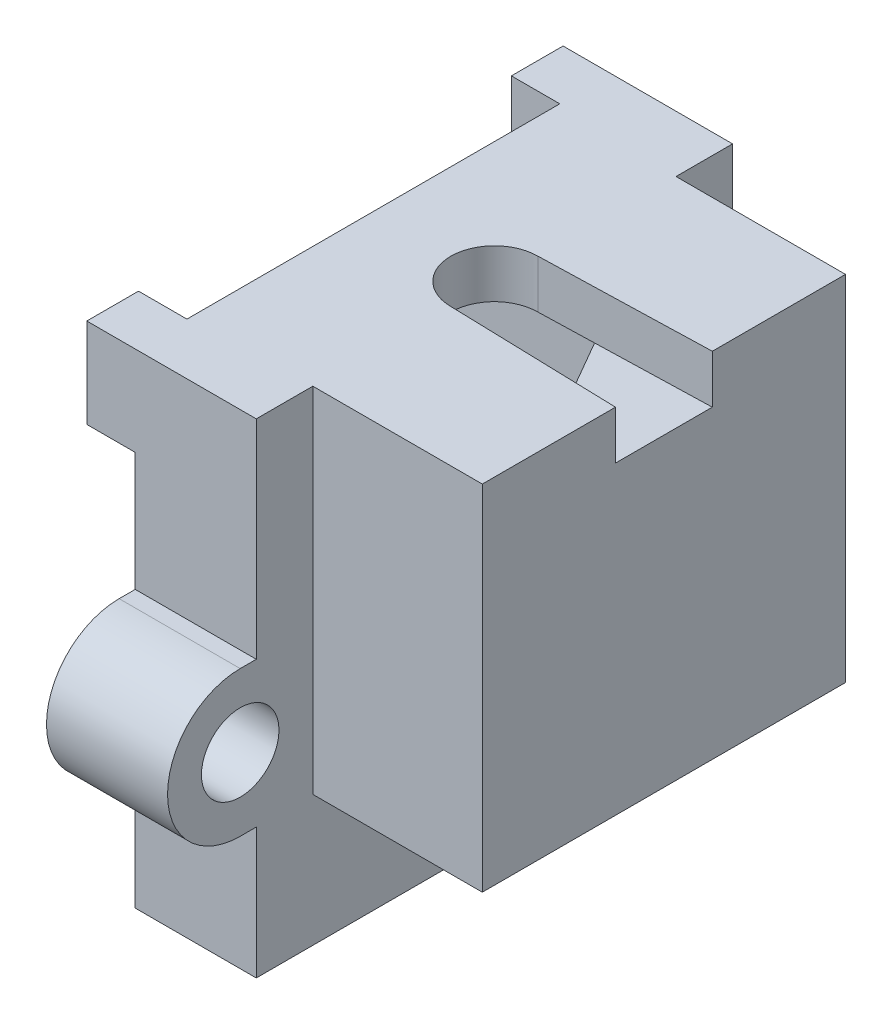
ISO-10303-21;
HEADER;
FILE_DESCRIPTION(('STEP AP214'),'2;1');
FILE_NAME('part.step','',(''),(''),'','','');
FILE_SCHEMA(('AUTOMOTIVE_DESIGN { 1 0 10303 214 1 1 1 1 }'));
ENDSEC;
DATA;
#1=APPLICATION_CONTEXT('core data for automotive mechanical design processes');
#2=APPLICATION_PROTOCOL_DEFINITION('international standard','automotive_design',2000,#1);
#3=PRODUCT_CONTEXT('',#1,'mechanical');
#4=PRODUCT('Part','Part','',(#3));
#5=PRODUCT_RELATED_PRODUCT_CATEGORY('part','',(#4));
#6=PRODUCT_DEFINITION_FORMATION('','',#4);
#7=PRODUCT_DEFINITION_CONTEXT('part definition',#1,'design');
#8=PRODUCT_DEFINITION('design','',#6,#7);
#9=PRODUCT_DEFINITION_SHAPE('','',#8);
#10=(LENGTH_UNIT() NAMED_UNIT(*) SI_UNIT(.MILLI.,.METRE.));
#11=(NAMED_UNIT(*) PLANE_ANGLE_UNIT() SI_UNIT($,.RADIAN.));
#12=(NAMED_UNIT(*) SI_UNIT($,.STERADIAN.) SOLID_ANGLE_UNIT());
#13=UNCERTAINTY_MEASURE_WITH_UNIT(LENGTH_MEASURE(1.E-05),#10,'distance_accuracy_value','');
#14=(GEOMETRIC_REPRESENTATION_CONTEXT(3) GLOBAL_UNCERTAINTY_ASSIGNED_CONTEXT((#13)) GLOBAL_UNIT_ASSIGNED_CONTEXT((#10,
#11,#12)) REPRESENTATION_CONTEXT('',''));
#15=CARTESIAN_POINT('',(0.,0.,0.));
#16=DIRECTION('',(0.,0.,1.));
#17=DIRECTION('',(1.,0.,0.));
#18=AXIS2_PLACEMENT_3D('',#15,#16,#17);
#19=CARTESIAN_POINT('',(-6.,20.,-7.5));
#20=DIRECTION('',(0.,0.,1.));
#21=DIRECTION('',(1.,0.,0.));
#22=AXIS2_PLACEMENT_3D('',#19,#20,#21);
#23=PLANE('',#22);
#24=DIRECTION('',(0.,-1.,0.));
#25=VECTOR('',#24,1.);
#26=CARTESIAN_POINT('',(6.,20.,-7.5));
#27=LINE('',#26,#25);
#28=CARTESIAN_POINT('',(6.,20.,-7.5));
#29=VERTEX_POINT('',#28);
#30=CARTESIAN_POINT('',(6.,5.40000000000002,-7.5));
#31=VERTEX_POINT('',#30);
#32=EDGE_CURVE('E506',#29,#31,#27,.T.);
#33=ORIENTED_EDGE('',*,*,#32,.T.);
#34=DIRECTION('',(1.,0.,0.));
#35=VECTOR('',#34,1.);
#36=CARTESIAN_POINT('',(-1.,5.40000000000002,-7.5));
#37=LINE('',#36,#35);
#38=CARTESIAN_POINT('',(-1.,5.40000000000002,-7.5));
#39=VERTEX_POINT('',#38);
#40=EDGE_CURVE('E286',#39,#31,#37,.T.);
#41=ORIENTED_EDGE('',*,*,#40,.F.);
#42=DIRECTION('',(0.,1.,0.));
#43=VECTOR('',#42,1.);
#44=CARTESIAN_POINT('',(-1.,11.4,-7.5));
#45=LINE('',#44,#43);
#46=CARTESIAN_POINT('',(-0.999999999999998,20.,-7.5));
#47=VERTEX_POINT('',#46);
#48=EDGE_CURVE('E452',#39,#47,#45,.T.);
#49=ORIENTED_EDGE('',*,*,#48,.T.);
#50=DIRECTION('',(-1.,0.,0.));
#51=VECTOR('',#50,1.);
#52=CARTESIAN_POINT('',(-6.,20.,-7.5));
#53=LINE('',#52,#51);
#54=EDGE_CURVE('E496',#29,#47,#53,.T.);
#55=ORIENTED_EDGE('',*,*,#54,.F.);
#56=EDGE_LOOP('',(#33,#41,#49,#55));
#57=FACE_BOUND('',#56,.T.);
#58=ADVANCED_FACE('F35',(#57),#23,.F.);
#59=CARTESIAN_POINT('',(-6.,20.,7.5));
#60=DIRECTION('',(0.,0.,-1.));
#61=DIRECTION('',(-1.,0.,0.));
#62=AXIS2_PLACEMENT_3D('',#59,#60,#61);
#63=PLANE('',#62);
#64=DIRECTION('',(0.,-1.,0.));
#65=VECTOR('',#64,1.);
#66=CARTESIAN_POINT('',(-1.,11.4,7.5));
#67=LINE('',#66,#65);
#68=CARTESIAN_POINT('',(-0.999999999999997,20.,7.5));
#69=VERTEX_POINT('',#68);
#70=CARTESIAN_POINT('',(-1.,5.40000000000002,7.5));
#71=VERTEX_POINT('',#70);
#72=EDGE_CURVE('E479',#69,#71,#67,.T.);
#73=ORIENTED_EDGE('',*,*,#72,.T.);
#74=DIRECTION('',(1.,0.,0.));
#75=VECTOR('',#74,1.);
#76=CARTESIAN_POINT('',(-1.,5.40000000000002,7.5));
#77=LINE('',#76,#75);
#78=CARTESIAN_POINT('',(6.,5.40000000000002,7.5));
#79=VERTEX_POINT('',#78);
#80=EDGE_CURVE('E288',#71,#79,#77,.T.);
#81=ORIENTED_EDGE('',*,*,#80,.T.);
#82=DIRECTION('',(0.,-1.,0.));
#83=VECTOR('',#82,1.);
#84=CARTESIAN_POINT('',(6.,20.,7.5));
#85=LINE('',#84,#83);
#86=CARTESIAN_POINT('',(6.,20.,7.5));
#87=VERTEX_POINT('',#86);
#88=EDGE_CURVE('E502',#87,#79,#85,.T.);
#89=ORIENTED_EDGE('',*,*,#88,.F.);
#90=DIRECTION('',(1.,0.,0.));
#91=VECTOR('',#90,1.);
#92=CARTESIAN_POINT('',(-6.,20.,7.5));
#93=LINE('',#92,#91);
#94=EDGE_CURVE('E501',#69,#87,#93,.T.);
#95=ORIENTED_EDGE('',*,*,#94,.F.);
#96=EDGE_LOOP('',(#73,#81,#89,#95));
#97=FACE_BOUND('',#96,.T.);
#98=ADVANCED_FACE('F581',(#97),#63,.F.);
#99=CARTESIAN_POINT('',(6.,20.,7.5));
#100=DIRECTION('',(-1.,0.,0.));
#101=DIRECTION('',(0.,0.,1.));
#102=AXIS2_PLACEMENT_3D('',#99,#100,#101);
#103=PLANE('',#102);
#104=ORIENTED_EDGE('',*,*,#88,.T.);
#105=DIRECTION('',(0.,0.,1.));
#106=VECTOR('',#105,1.);
#107=CARTESIAN_POINT('',(6.,5.40000000000002,7.5));
#108=LINE('',#107,#106);
#109=EDGE_CURVE('E279',#31,#79,#108,.T.);
#110=ORIENTED_EDGE('',*,*,#109,.F.);
#111=ORIENTED_EDGE('',*,*,#32,.F.);
#112=DIRECTION('',(0.,0.,-1.));
#113=VECTOR('',#112,1.);
#114=CARTESIAN_POINT('',(6.,20.,7.5));
#115=LINE('',#114,#113);
#116=CARTESIAN_POINT('',(6.,20.,-2.));
#117=VERTEX_POINT('',#116);
#118=EDGE_CURVE('E256',#117,#29,#115,.T.);
#119=ORIENTED_EDGE('',*,*,#118,.F.);
#120=DIRECTION('',(0.,-1.,0.));
#121=VECTOR('',#120,1.);
#122=CARTESIAN_POINT('',(6.,20.,-2.));
#123=LINE('',#122,#121);
#124=CARTESIAN_POINT('',(6.,18.,-2.));
#125=VERTEX_POINT('',#124);
#126=EDGE_CURVE('E382',#117,#125,#123,.T.);
#127=ORIENTED_EDGE('',*,*,#126,.T.);
#128=DIRECTION('',(0.,0.,-1.));
#129=VECTOR('',#128,1.);
#130=CARTESIAN_POINT('',(6.,18.,-2.));
#131=LINE('',#130,#129);
#132=CARTESIAN_POINT('',(6.,18.,2.));
#133=VERTEX_POINT('',#132);
#134=EDGE_CURVE('E377',#133,#125,#131,.T.);
#135=ORIENTED_EDGE('',*,*,#134,.F.);
#136=DIRECTION('',(0.,-1.,0.));
#137=VECTOR('',#136,1.);
#138=CARTESIAN_POINT('',(6.,20.,2.));
#139=LINE('',#138,#137);
#140=CARTESIAN_POINT('',(6.,20.,2.));
#141=VERTEX_POINT('',#140);
#142=EDGE_CURVE('E385',#141,#133,#139,.T.);
#143=ORIENTED_EDGE('',*,*,#142,.F.);
#144=EDGE_CURVE('E493',#87,#141,#115,.T.);
#145=ORIENTED_EDGE('',*,*,#144,.F.);
#146=EDGE_LOOP('',(#104,#110,#111,#119,#127,#135,#143,#145));
#147=FACE_BOUND('',#146,.T.);
#148=ADVANCED_FACE('F37',(#147),#103,.F.);
#149=CARTESIAN_POINT('',(0.,20.,0.));
#150=DIRECTION('',(0.,-1.,0.));
#151=DIRECTION('',(0.,0.,-1.));
#152=AXIS2_PLACEMENT_3D('',#149,#150,#151);
#153=PLANE('',#152);
#154=DIRECTION('',(1.,0.,0.));
#155=VECTOR('',#154,1.);
#156=CARTESIAN_POINT('',(-8.,20.,-7.70000000000001));
#157=LINE('',#156,#155);
#158=CARTESIAN_POINT('',(-8.,20.,-7.70000000000001));
#159=VERTEX_POINT('',#158);
#160=CARTESIAN_POINT('',(-5.99999999999999,20.,-7.70000000000001));
#161=VERTEX_POINT('',#160);
#162=EDGE_CURVE('E337',#159,#161,#157,.T.);
#163=ORIENTED_EDGE('',*,*,#162,.T.);
#164=DIRECTION('',(0.,0.,1.));
#165=VECTOR('',#164,1.);
#166=CARTESIAN_POINT('',(-6.,20.,7.5));
#167=LINE('',#166,#165);
#168=CARTESIAN_POINT('',(-5.99999999999999,20.,7.70000000000001));
#169=VERTEX_POINT('',#168);
#170=EDGE_CURVE('E499',#161,#169,#167,.T.);
#171=ORIENTED_EDGE('',*,*,#170,.T.);
#172=DIRECTION('',(-1.,0.,0.));
#173=VECTOR('',#172,1.);
#174=CARTESIAN_POINT('',(-8.,20.,7.70000000000001));
#175=LINE('',#174,#173);
#176=CARTESIAN_POINT('',(-8.,20.,7.70000000000001));
#177=VERTEX_POINT('',#176);
#178=EDGE_CURVE('E317',#169,#177,#175,.T.);
#179=ORIENTED_EDGE('',*,*,#178,.T.);
#180=DIRECTION('',(0.,0.,1.));
#181=VECTOR('',#180,1.);
#182=CARTESIAN_POINT('',(-8.,20.,7.70000000000001));
#183=LINE('',#182,#181);
#184=CARTESIAN_POINT('',(-8.,20.,9.8360679774998));
#185=VERTEX_POINT('',#184);
#186=EDGE_CURVE('E320',#177,#185,#183,.T.);
#187=ORIENTED_EDGE('',*,*,#186,.T.);
#188=DIRECTION('',(1.,0.,0.));
#189=VECTOR('',#188,1.);
#190=CARTESIAN_POINT('',(-8.,20.,9.8360679774998));
#191=LINE('',#190,#189);
#192=CARTESIAN_POINT('',(-0.999999999999997,20.,9.8360679774998));
#193=VERTEX_POINT('',#192);
#194=EDGE_CURVE('E308',#185,#193,#191,.T.);
#195=ORIENTED_EDGE('',*,*,#194,.T.);
#196=DIRECTION('',(0.,0.,-1.));
#197=VECTOR('',#196,1.);
#198=CARTESIAN_POINT('',(-0.999999999999997,20.,9.8360679774998));
#199=LINE('',#198,#197);
#200=EDGE_CURVE('E303',#193,#69,#199,.T.);
#201=ORIENTED_EDGE('',*,*,#200,.T.);
#202=ORIENTED_EDGE('',*,*,#94,.T.);
#203=ORIENTED_EDGE('',*,*,#144,.T.);
#204=DIRECTION('',(0.999592086460695,0.,0.028559773898877));
#205=VECTOR('',#204,1.);
#206=CARTESIAN_POINT('',(6.,20.,2.));
#207=LINE('',#206,#205);
#208=CARTESIAN_POINT('',(-1.00000000000001,20.,1.8));
#209=VERTEX_POINT('',#208);
#210=EDGE_CURVE('E365',#209,#141,#207,.T.);
#211=ORIENTED_EDGE('',*,*,#210,.F.);
#212=CARTESIAN_POINT('',(-1.00000000000001,20.,0.));
#213=DIRECTION('',(0.,1.,0.));
#214=DIRECTION('',(0.,0.,1.));
#215=AXIS2_PLACEMENT_3D('',#212,#213,#214);
#216=CIRCLE('',#215,1.8);
#217=CARTESIAN_POINT('',(-1.00000000000001,20.,-1.8));
#218=VERTEX_POINT('',#217);
#219=EDGE_CURVE('E363',#218,#209,#216,.T.);
#220=ORIENTED_EDGE('',*,*,#219,.F.);
#221=DIRECTION('',(-0.999592086460695,0.,0.028559773898877));
#222=VECTOR('',#221,1.);
#223=CARTESIAN_POINT('',(-1.00000000000001,20.,-1.8));
#224=LINE('',#223,#222);
#225=EDGE_CURVE('E368',#117,#218,#224,.T.);
#226=ORIENTED_EDGE('',*,*,#225,.F.);
#227=ORIENTED_EDGE('',*,*,#118,.T.);
#228=ORIENTED_EDGE('',*,*,#54,.T.);
#229=DIRECTION('',(0.,0.,-1.));
#230=VECTOR('',#229,1.);
#231=CARTESIAN_POINT('',(-0.999999999999997,20.,-9.8360679774998));
#232=LINE('',#231,#230);
#233=CARTESIAN_POINT('',(-0.999999999999997,20.,-9.8360679774998));
#234=VERTEX_POINT('',#233);
#235=EDGE_CURVE('E327',#47,#234,#232,.T.);
#236=ORIENTED_EDGE('',*,*,#235,.T.);
#237=DIRECTION('',(-1.,0.,0.));
#238=VECTOR('',#237,1.);
#239=CARTESIAN_POINT('',(-8.,20.,-9.8360679774998));
#240=LINE('',#239,#238);
#241=CARTESIAN_POINT('',(-8.,20.,-9.8360679774998));
#242=VERTEX_POINT('',#241);
#243=EDGE_CURVE('E346',#234,#242,#240,.T.);
#244=ORIENTED_EDGE('',*,*,#243,.T.);
#245=DIRECTION('',(0.,0.,1.));
#246=VECTOR('',#245,1.);
#247=CARTESIAN_POINT('',(-8.,20.,-7.70000000000001));
#248=LINE('',#247,#246);
#249=EDGE_CURVE('E348',#242,#159,#248,.T.);
#250=ORIENTED_EDGE('',*,*,#249,.T.);
#251=EDGE_LOOP('',(#163,#171,#179,#187,#195,#201,#202,#203,#211,#220,#226,#227,#228,#236,#244,#250));
#252=FACE_BOUND('',#251,.T.);
#253=ADVANCED_FACE('F533',(#252),#153,.F.);
#254=CARTESIAN_POINT('',(0.,18.,0.));
#255=DIRECTION('',(0.,1.,0.));
#256=DIRECTION('',(0.,0.,1.));
#257=AXIS2_PLACEMENT_3D('',#254,#255,#256);
#258=PLANE('',#257);
#259=DIRECTION('',(0.999592086460695,0.,0.028559773898877));
#260=VECTOR('',#259,1.);
#261=CARTESIAN_POINT('',(6.,18.,2.));
#262=LINE('',#261,#260);
#263=CARTESIAN_POINT('',(-1.00000000000001,18.,1.8));
#264=VERTEX_POINT('',#263);
#265=CARTESIAN_POINT('',(1.27192404928891,18.,1.86491211569397));
#266=VERTEX_POINT('',#265);
#267=EDGE_CURVE('E374',#264,#266,#262,.T.);
#268=ORIENTED_EDGE('',*,*,#267,.T.);
#269=DIRECTION('',(0.5,0.,-0.866025403784439));
#270=VECTOR('',#269,1.);
#271=CARTESIAN_POINT('',(0.674315780649904,18.,2.9));
#272=LINE('',#271,#270);
#273=CARTESIAN_POINT('',(0.674315780649904,18.,2.9));
#274=VERTEX_POINT('',#273);
#275=EDGE_CURVE('E393',#274,#266,#272,.T.);
#276=ORIENTED_EDGE('',*,*,#275,.F.);
#277=DIRECTION('',(1.,0.,0.));
#278=VECTOR('',#277,1.);
#279=CARTESIAN_POINT('',(-2.67431578064993,18.,2.9));
#280=LINE('',#279,#278);
#281=CARTESIAN_POINT('',(-6.,18.,2.9));
#282=VERTEX_POINT('',#281);
#283=EDGE_CURVE('E398',#282,#274,#280,.T.);
#284=ORIENTED_EDGE('',*,*,#283,.F.);
#285=DIRECTION('',(0.,0.,1.));
#286=VECTOR('',#285,1.);
#287=CARTESIAN_POINT('',(-6.,18.,-2.90000000000001));
#288=LINE('',#287,#286);
#289=CARTESIAN_POINT('',(-6.,18.,-2.90000000000001));
#290=VERTEX_POINT('',#289);
#291=EDGE_CURVE('E418',#290,#282,#288,.T.);
#292=ORIENTED_EDGE('',*,*,#291,.F.);
#293=DIRECTION('',(-1.,0.,0.));
#294=VECTOR('',#293,1.);
#295=CARTESIAN_POINT('',(-2.67431578064993,18.,-2.90000000000001));
#296=LINE('',#295,#294);
#297=CARTESIAN_POINT('',(0.674315780649902,18.,-2.9));
#298=VERTEX_POINT('',#297);
#299=EDGE_CURVE('E415',#298,#290,#296,.T.);
#300=ORIENTED_EDGE('',*,*,#299,.F.);
#301=DIRECTION('',(-0.5,0.,-0.866025403784438));
#302=VECTOR('',#301,1.);
#303=CARTESIAN_POINT('',(2.34863156129982,18.,0.));
#304=LINE('',#303,#302);
#305=CARTESIAN_POINT('',(1.27192404928891,18.,-1.86491211569397));
#306=VERTEX_POINT('',#305);
#307=EDGE_CURVE('E411',#306,#298,#304,.T.);
#308=ORIENTED_EDGE('',*,*,#307,.F.);
#309=DIRECTION('',(-0.999592086460695,0.,0.028559773898877));
#310=VECTOR('',#309,1.);
#311=CARTESIAN_POINT('',(-1.00000000000001,18.,-1.8));
#312=LINE('',#311,#310);
#313=CARTESIAN_POINT('',(-1.00000000000001,18.,-1.8));
#314=VERTEX_POINT('',#313);
#315=EDGE_CURVE('E379',#306,#314,#312,.T.);
#316=ORIENTED_EDGE('',*,*,#315,.T.);
#317=CARTESIAN_POINT('',(-1.00000000000001,18.,0.));
#318=DIRECTION('',(0.,1.,0.));
#319=DIRECTION('',(0.,0.,1.));
#320=AXIS2_PLACEMENT_3D('',#317,#318,#319);
#321=CIRCLE('',#320,1.8);
#322=EDGE_CURVE('E356',#314,#264,#321,.T.);
#323=ORIENTED_EDGE('',*,*,#322,.T.);
#324=EDGE_LOOP('',(#268,#276,#284,#292,#300,#308,#316,#323));
#325=FACE_BOUND('',#324,.T.);
#326=ADVANCED_FACE('F590',(#325),#258,.F.);
#327=CARTESIAN_POINT('',(-6.,20.,7.5));
#328=DIRECTION('',(1.,0.,0.));
#329=DIRECTION('',(0.,0.,-1.));
#330=AXIS2_PLACEMENT_3D('',#327,#328,#329);
#331=PLANE('',#330);
#332=DIRECTION('',(0.,1.,0.));
#333=VECTOR('',#332,1.);
#334=CARTESIAN_POINT('',(-6.,5.40000000000002,-9.8360679774998));
#335=LINE('',#334,#333);
#336=CARTESIAN_POINT('',(-6.,0.,-9.8360679774998));
#337=VERTEX_POINT('',#336);
#338=CARTESIAN_POINT('',(-6.,5.40000000000002,-9.8360679774998));
#339=VERTEX_POINT('',#338);
#340=EDGE_CURVE('E252',#337,#339,#335,.T.);
#341=ORIENTED_EDGE('',*,*,#340,.F.);
#342=DIRECTION('',(0.,0.,1.));
#343=VECTOR('',#342,1.);
#344=CARTESIAN_POINT('',(-6.,0.,7.5));
#345=LINE('',#344,#343);
#346=CARTESIAN_POINT('',(-6.,0.,9.8360679774998));
#347=VERTEX_POINT('',#346);
#348=EDGE_CURVE('E245',#337,#347,#345,.T.);
#349=ORIENTED_EDGE('',*,*,#348,.T.);
#350=DIRECTION('',(0.,-1.,0.));
#351=VECTOR('',#350,1.);
#352=CARTESIAN_POINT('',(-6.,5.40000000000002,9.8360679774998));
#353=LINE('',#352,#351);
#354=CARTESIAN_POINT('',(-6.,5.40000000000002,9.8360679774998));
#355=VERTEX_POINT('',#354);
#356=EDGE_CURVE('E250',#355,#347,#353,.T.);
#357=ORIENTED_EDGE('',*,*,#356,.F.);
#358=DIRECTION('',(0.,0.,1.));
#359=VECTOR('',#358,1.);
#360=CARTESIAN_POINT('',(-6.,5.40000000000002,7.5));
#361=LINE('',#360,#359);
#362=CARTESIAN_POINT('',(-6.,5.40000000000002,10.5));
#363=VERTEX_POINT('',#362);
#364=EDGE_CURVE('E50',#355,#363,#361,.T.);
#365=ORIENTED_EDGE('',*,*,#364,.T.);
#366=CARTESIAN_POINT('',(-6.,8.40000000000002,10.5));
#367=DIRECTION('',(-1.,0.,0.));
#368=DIRECTION('',(0.,0.,1.));
#369=AXIS2_PLACEMENT_3D('',#366,#367,#368);
#370=CIRCLE('',#369,3.);
#371=CARTESIAN_POINT('',(-6.,11.4,10.5));
#372=VERTEX_POINT('',#371);
#373=EDGE_CURVE('E470',#363,#372,#370,.T.);
#374=ORIENTED_EDGE('',*,*,#373,.T.);
#375=DIRECTION('',(0.,0.,-1.));
#376=VECTOR('',#375,1.);
#377=CARTESIAN_POINT('',(-6.,11.4,10.5));
#378=LINE('',#377,#376);
#379=CARTESIAN_POINT('',(-6.,11.4,9.8360679774998));
#380=VERTEX_POINT('',#379);
#381=EDGE_CURVE('E487',#372,#380,#378,.T.);
#382=ORIENTED_EDGE('',*,*,#381,.T.);
#383=DIRECTION('',(0.,-1.,0.));
#384=VECTOR('',#383,1.);
#385=CARTESIAN_POINT('',(-6.,20.,9.8360679774998));
#386=LINE('',#385,#384);
#387=CARTESIAN_POINT('',(-6.,16.3,9.8360679774998));
#388=VERTEX_POINT('',#387);
#389=EDGE_CURVE('E298',#388,#380,#386,.T.);
#390=ORIENTED_EDGE('',*,*,#389,.F.);
#391=DIRECTION('',(0.,0.,1.));
#392=VECTOR('',#391,1.);
#393=CARTESIAN_POINT('',(-6.,16.3,0.));
#394=LINE('',#393,#392);
#395=CARTESIAN_POINT('',(-6.,16.3,7.70000000000001));
#396=VERTEX_POINT('',#395);
#397=EDGE_CURVE('E43',#396,#388,#394,.T.);
#398=ORIENTED_EDGE('',*,*,#397,.F.);
#399=DIRECTION('',(0.,1.,0.));
#400=VECTOR('',#399,1.);
#401=CARTESIAN_POINT('',(-5.99999999999999,16.3,7.70000000000001));
#402=LINE('',#401,#400);
#403=EDGE_CURVE('E314',#396,#169,#402,.T.);
#404=ORIENTED_EDGE('',*,*,#403,.T.);
#405=ORIENTED_EDGE('',*,*,#170,.F.);
#406=DIRECTION('',(0.,1.,0.));
#407=VECTOR('',#406,1.);
#408=CARTESIAN_POINT('',(-5.99999999999999,16.3,-7.70000000000001));
#409=LINE('',#408,#407);
#410=CARTESIAN_POINT('',(-6.,16.3,-7.70000000000001));
#411=VERTEX_POINT('',#410);
#412=EDGE_CURVE('E353',#411,#161,#409,.T.);
#413=ORIENTED_EDGE('',*,*,#412,.F.);
#414=DIRECTION('',(0.,0.,1.));
#415=VECTOR('',#414,1.);
#416=CARTESIAN_POINT('',(-6.,16.3,0.));
#417=LINE('',#416,#415);
#418=CARTESIAN_POINT('',(-6.,16.3,-9.8360679774998));
#419=VERTEX_POINT('',#418);
#420=EDGE_CURVE('E11',#419,#411,#417,.T.);
#421=ORIENTED_EDGE('',*,*,#420,.F.);
#422=DIRECTION('',(0.,1.,0.));
#423=VECTOR('',#422,1.);
#424=CARTESIAN_POINT('',(-6.,20.,-9.8360679774998));
#425=LINE('',#424,#423);
#426=CARTESIAN_POINT('',(-6.,11.4,-9.8360679774998));
#427=VERTEX_POINT('',#426);
#428=EDGE_CURVE('E291',#427,#419,#425,.T.);
#429=ORIENTED_EDGE('',*,*,#428,.F.);
#430=DIRECTION('',(0.,0.,-1.));
#431=VECTOR('',#430,1.);
#432=CARTESIAN_POINT('',(-6.,11.4,-10.5));
#433=LINE('',#432,#431);
#434=CARTESIAN_POINT('',(-6.,11.4,-10.5));
#435=VERTEX_POINT('',#434);
#436=EDGE_CURVE('E450',#427,#435,#433,.T.);
#437=ORIENTED_EDGE('',*,*,#436,.T.);
#438=CARTESIAN_POINT('',(-6.,8.40000000000002,-10.5));
#439=DIRECTION('',(-1.,0.,0.));
#440=DIRECTION('',(0.,0.,1.));
#441=AXIS2_PLACEMENT_3D('',#438,#439,#440);
#442=CIRCLE('',#441,3.);
#443=CARTESIAN_POINT('',(-6.,5.40000000000002,-10.5));
#444=VERTEX_POINT('',#443);
#445=EDGE_CURVE('E443',#435,#444,#442,.T.);
#446=ORIENTED_EDGE('',*,*,#445,.T.);
#447=DIRECTION('',(0.,0.,1.));
#448=VECTOR('',#447,1.);
#449=CARTESIAN_POINT('',(-6.,5.40000000000002,-7.5));
#450=LINE('',#449,#448);
#451=EDGE_CURVE('E459',#444,#339,#450,.T.);
#452=ORIENTED_EDGE('',*,*,#451,.T.);
#453=EDGE_LOOP('',(#341,#349,#357,#365,#374,#382,#390,#398,#404,#405,#413,#421,#429,#437,#446,#452));
#454=FACE_BOUND('',#453,.T.);
#455=CARTESIAN_POINT('',(-6.,8.40000000000002,-10.5));
#456=DIRECTION('',(-1.,0.,0.));
#457=DIRECTION('',(0.,0.,1.));
#458=AXIS2_PLACEMENT_3D('',#455,#456,#457);
#459=CIRCLE('',#458,1.6);
#460=CARTESIAN_POINT('',(-6.,8.40000000000002,-8.9));
#461=VERTEX_POINT('',#460);
#462=EDGE_CURVE('E439',#461,#461,#459,.T.);
#463=ORIENTED_EDGE('',*,*,#462,.F.);
#464=EDGE_LOOP('',(#463));
#465=FACE_BOUND('',#464,.T.);
#466=CARTESIAN_POINT('',(-6.,8.40000000000002,10.5));
#467=DIRECTION('',(-1.,0.,0.));
#468=DIRECTION('',(0.,0.,1.));
#469=AXIS2_PLACEMENT_3D('',#466,#467,#468);
#470=CIRCLE('',#469,1.6);
#471=CARTESIAN_POINT('',(-6.,8.40000000000002,12.1));
#472=VERTEX_POINT('',#471);
#473=EDGE_CURVE('E465',#472,#472,#470,.T.);
#474=ORIENTED_EDGE('',*,*,#473,.F.);
#475=EDGE_LOOP('',(#474));
#476=FACE_BOUND('',#475,.T.);
#477=DIRECTION('',(0.,0.,1.));
#478=VECTOR('',#477,1.);
#479=CARTESIAN_POINT('',(-6.,15.,-2.90000000000001));
#480=LINE('',#479,#478);
#481=CARTESIAN_POINT('',(-6.,15.,-2.90000000000001));
#482=VERTEX_POINT('',#481);
#483=CARTESIAN_POINT('',(-6.,15.,2.9));
#484=VERTEX_POINT('',#483);
#485=EDGE_CURVE('E403',#482,#484,#480,.T.);
#486=ORIENTED_EDGE('',*,*,#485,.F.);
#487=DIRECTION('',(0.,1.,0.));
#488=VECTOR('',#487,1.);
#489=CARTESIAN_POINT('',(-6.,15.,-2.90000000000001));
#490=LINE('',#489,#488);
#491=EDGE_CURVE('E428',#482,#290,#490,.T.);
#492=ORIENTED_EDGE('',*,*,#491,.T.);
#493=ORIENTED_EDGE('',*,*,#291,.T.);
#494=DIRECTION('',(0.,1.,0.));
#495=VECTOR('',#494,1.);
#496=CARTESIAN_POINT('',(-6.,15.,2.9));
#497=LINE('',#496,#495);
#498=EDGE_CURVE('E426',#484,#282,#497,.T.);
#499=ORIENTED_EDGE('',*,*,#498,.F.);
#500=EDGE_LOOP('',(#486,#492,#493,#499));
#501=FACE_BOUND('',#500,.T.);
#502=ADVANCED_FACE('F247',(#454,#465,#476,#501),#331,.F.);
#503=CARTESIAN_POINT('',(0.,0.,0.));
#504=DIRECTION('',(0.,-1.,0.));
#505=DIRECTION('',(0.,0.,-1.));
#506=AXIS2_PLACEMENT_3D('',#503,#504,#505);
#507=PLANE('',#506);
#508=DIRECTION('',(0.,0.,-1.));
#509=VECTOR('',#508,1.);
#510=CARTESIAN_POINT('',(-1.,0.,7.5));
#511=LINE('',#510,#509);
#512=CARTESIAN_POINT('',(-1.,0.,9.8360679774998));
#513=VERTEX_POINT('',#512);
#514=CARTESIAN_POINT('',(-1.,0.,-9.8360679774998));
#515=VERTEX_POINT('',#514);
#516=EDGE_CURVE('E262',#513,#515,#511,.T.);
#517=ORIENTED_EDGE('',*,*,#516,.F.);
#518=DIRECTION('',(1.,0.,0.));
#519=VECTOR('',#518,1.);
#520=CARTESIAN_POINT('',(-6.,0.,9.8360679774998));
#521=LINE('',#520,#519);
#522=EDGE_CURVE('E260',#347,#513,#521,.T.);
#523=ORIENTED_EDGE('',*,*,#522,.F.);
#524=ORIENTED_EDGE('',*,*,#348,.F.);
#525=DIRECTION('',(1.,0.,0.));
#526=VECTOR('',#525,1.);
#527=CARTESIAN_POINT('',(-6.,0.,-9.8360679774998));
#528=LINE('',#527,#526);
#529=EDGE_CURVE('E266',#337,#515,#528,.T.);
#530=ORIENTED_EDGE('',*,*,#529,.T.);
#531=EDGE_LOOP('',(#517,#523,#524,#530));
#532=FACE_BOUND('',#531,.T.);
#533=ADVANCED_FACE('F261',(#532),#507,.T.);
#534=CARTESIAN_POINT('',(-1.,8.40000000000002,10.5));
#535=DIRECTION('',(-1.,0.,0.));
#536=DIRECTION('',(0.,0.,1.));
#537=AXIS2_PLACEMENT_3D('',#534,#535,#536);
#538=CYLINDRICAL_SURFACE('',#537,3.);
#539=ORIENTED_EDGE('',*,*,#373,.F.);
#540=DIRECTION('',(-1.,0.,0.));
#541=VECTOR('',#540,1.);
#542=CARTESIAN_POINT('',(-1.,5.40000000000002,10.5));
#543=LINE('',#542,#541);
#544=CARTESIAN_POINT('',(-1.,5.40000000000002,10.5));
#545=VERTEX_POINT('',#544);
#546=EDGE_CURVE('E257',#545,#363,#543,.T.);
#547=ORIENTED_EDGE('',*,*,#546,.F.);
#548=CARTESIAN_POINT('',(-1.,8.40000000000002,10.5));
#549=DIRECTION('',(-1.,0.,0.));
#550=DIRECTION('',(0.,0.,1.));
#551=AXIS2_PLACEMENT_3D('',#548,#549,#550);
#552=CIRCLE('',#551,3.);
#553=CARTESIAN_POINT('',(-1.,11.4,10.5));
#554=VERTEX_POINT('',#553);
#555=EDGE_CURVE('E473',#545,#554,#552,.T.);
#556=ORIENTED_EDGE('',*,*,#555,.T.);
#557=DIRECTION('',(-1.,0.,0.));
#558=VECTOR('',#557,1.);
#559=CARTESIAN_POINT('',(-1.,11.4,10.5));
#560=LINE('',#559,#558);
#561=EDGE_CURVE('E484',#554,#372,#560,.T.);
#562=ORIENTED_EDGE('',*,*,#561,.T.);
#563=EDGE_LOOP('',(#539,#547,#556,#562));
#564=FACE_BOUND('',#563,.T.);
#565=ADVANCED_FACE('F569',(#564),#538,.T.);
#566=CARTESIAN_POINT('',(-1.,5.40000000000002,7.5));
#567=DIRECTION('',(0.,-1.,0.));
#568=DIRECTION('',(0.,0.,-1.));
#569=AXIS2_PLACEMENT_3D('',#566,#567,#568);
#570=PLANE('',#569);
#571=DIRECTION('',(1.,0.,0.));
#572=VECTOR('',#571,1.);
#573=CARTESIAN_POINT('',(-6.,5.40000000000002,9.8360679774998));
#574=LINE('',#573,#572);
#575=CARTESIAN_POINT('',(-1.,5.40000000000002,9.8360679774998));
#576=VERTEX_POINT('',#575);
#577=EDGE_CURVE('E267',#355,#576,#574,.T.);
#578=ORIENTED_EDGE('',*,*,#577,.T.);
#579=DIRECTION('',(0.,0.,1.));
#580=VECTOR('',#579,1.);
#581=CARTESIAN_POINT('',(-1.,5.40000000000002,7.5));
#582=LINE('',#581,#580);
#583=EDGE_CURVE('E482',#576,#545,#582,.T.);
#584=ORIENTED_EDGE('',*,*,#583,.T.);
#585=ORIENTED_EDGE('',*,*,#546,.T.);
#586=ORIENTED_EDGE('',*,*,#364,.F.);
#587=EDGE_LOOP('',(#578,#584,#585,#586));
#588=FACE_BOUND('',#587,.T.);
#589=ADVANCED_FACE('F566',(#588),#570,.T.);
#590=CARTESIAN_POINT('',(-1.,11.4,10.5));
#591=DIRECTION('',(0.,1.,0.));
#592=DIRECTION('',(0.,0.,1.));
#593=AXIS2_PLACEMENT_3D('',#590,#591,#592);
#594=PLANE('',#593);
#595=DIRECTION('',(1.,0.,0.));
#596=VECTOR('',#595,1.);
#597=CARTESIAN_POINT('',(-6.,11.4,9.8360679774998));
#598=LINE('',#597,#596);
#599=CARTESIAN_POINT('',(-1.,11.4,9.8360679774998));
#600=VERTEX_POINT('',#599);
#601=EDGE_CURVE('E300',#380,#600,#598,.T.);
#602=ORIENTED_EDGE('',*,*,#601,.F.);
#603=ORIENTED_EDGE('',*,*,#381,.F.);
#604=ORIENTED_EDGE('',*,*,#561,.F.);
#605=DIRECTION('',(0.,0.,-1.));
#606=VECTOR('',#605,1.);
#607=CARTESIAN_POINT('',(-1.,11.4,10.5));
#608=LINE('',#607,#606);
#609=EDGE_CURVE('E476',#554,#600,#608,.T.);
#610=ORIENTED_EDGE('',*,*,#609,.T.);
#611=EDGE_LOOP('',(#602,#603,#604,#610));
#612=FACE_BOUND('',#611,.T.);
#613=ADVANCED_FACE('F568',(#612),#594,.T.);
#614=CARTESIAN_POINT('',(-1.,8.40000000000002,10.5));
#615=DIRECTION('',(-1.,0.,0.));
#616=DIRECTION('',(0.,0.,1.));
#617=AXIS2_PLACEMENT_3D('',#614,#615,#616);
#618=PLANE('',#617);
#619=CARTESIAN_POINT('',(-1.,8.40000000000002,10.5));
#620=DIRECTION('',(-1.,0.,0.));
#621=DIRECTION('',(0.,0.,1.));
#622=AXIS2_PLACEMENT_3D('',#619,#620,#621);
#623=CIRCLE('',#622,1.6);
#624=CARTESIAN_POINT('',(-1.,8.40000000000002,12.1));
#625=VERTEX_POINT('',#624);
#626=EDGE_CURVE('E467',#625,#625,#623,.T.);
#627=ORIENTED_EDGE('',*,*,#626,.T.);
#628=EDGE_LOOP('',(#627));
#629=FACE_BOUND('',#628,.T.);
#630=ORIENTED_EDGE('',*,*,#555,.F.);
#631=ORIENTED_EDGE('',*,*,#583,.F.);
#632=DIRECTION('',(0.,-1.,0.));
#633=VECTOR('',#632,1.);
#634=CARTESIAN_POINT('',(-1.,5.40000000000002,9.8360679774998));
#635=LINE('',#634,#633);
#636=EDGE_CURVE('E272',#576,#513,#635,.T.);
#637=ORIENTED_EDGE('',*,*,#636,.T.);
#638=ORIENTED_EDGE('',*,*,#516,.T.);
#639=DIRECTION('',(0.,1.,0.));
#640=VECTOR('',#639,1.);
#641=CARTESIAN_POINT('',(-1.,5.40000000000002,-9.8360679774998));
#642=LINE('',#641,#640);
#643=CARTESIAN_POINT('',(-1.,5.40000000000002,-9.8360679774998));
#644=VERTEX_POINT('',#643);
#645=EDGE_CURVE('E275',#515,#644,#642,.T.);
#646=ORIENTED_EDGE('',*,*,#645,.T.);
#647=DIRECTION('',(0.,0.,1.));
#648=VECTOR('',#647,1.);
#649=CARTESIAN_POINT('',(-1.,5.40000000000002,-7.5));
#650=LINE('',#649,#648);
#651=CARTESIAN_POINT('',(-1.,5.40000000000002,-10.5));
#652=VERTEX_POINT('',#651);
#653=EDGE_CURVE('E449',#652,#644,#650,.T.);
#654=ORIENTED_EDGE('',*,*,#653,.F.);
#655=CARTESIAN_POINT('',(-1.,8.40000000000002,-10.5));
#656=DIRECTION('',(-1.,0.,0.));
#657=DIRECTION('',(0.,0.,1.));
#658=AXIS2_PLACEMENT_3D('',#655,#656,#657);
#659=CIRCLE('',#658,3.);
#660=CARTESIAN_POINT('',(-1.,11.4,-10.5));
#661=VERTEX_POINT('',#660);
#662=EDGE_CURVE('E446',#661,#652,#659,.T.);
#663=ORIENTED_EDGE('',*,*,#662,.F.);
#664=DIRECTION('',(0.,0.,-1.));
#665=VECTOR('',#664,1.);
#666=CARTESIAN_POINT('',(-1.,11.4,-10.5));
#667=LINE('',#666,#665);
#668=CARTESIAN_POINT('',(-1.,11.4,-9.8360679774998));
#669=VERTEX_POINT('',#668);
#670=EDGE_CURVE('E454',#669,#661,#667,.T.);
#671=ORIENTED_EDGE('',*,*,#670,.F.);
#672=DIRECTION('',(0.,1.,0.));
#673=VECTOR('',#672,1.);
#674=CARTESIAN_POINT('',(-0.999999999999997,16.3,-9.8360679774998));
#675=LINE('',#674,#673);
#676=EDGE_CURVE('E343',#669,#234,#675,.T.);
#677=ORIENTED_EDGE('',*,*,#676,.T.);
#678=ORIENTED_EDGE('',*,*,#235,.F.);
#679=ORIENTED_EDGE('',*,*,#48,.F.);
#680=DIRECTION('',(0.,0.,1.));
#681=VECTOR('',#680,1.);
#682=CARTESIAN_POINT('',(-1.,5.40000000000002,7.5));
#683=LINE('',#682,#681);
#684=EDGE_CURVE('E283',#39,#71,#683,.T.);
#685=ORIENTED_EDGE('',*,*,#684,.T.);
#686=ORIENTED_EDGE('',*,*,#72,.F.);
#687=ORIENTED_EDGE('',*,*,#200,.F.);
#688=DIRECTION('',(0.,1.,0.));
#689=VECTOR('',#688,1.);
#690=CARTESIAN_POINT('',(-0.999999999999997,16.3,9.8360679774998));
#691=LINE('',#690,#689);
#692=EDGE_CURVE('E324',#600,#193,#691,.T.);
#693=ORIENTED_EDGE('',*,*,#692,.F.);
#694=ORIENTED_EDGE('',*,*,#609,.F.);
#695=EDGE_LOOP('',(#630,#631,#637,#638,#646,#654,#663,#671,#677,#678,#679,#685,#686,#687,#693,#694));
#696=FACE_BOUND('',#695,.T.);
#697=CARTESIAN_POINT('',(-1.,8.40000000000002,-10.5));
#698=DIRECTION('',(-1.,0.,0.));
#699=DIRECTION('',(0.,0.,1.));
#700=AXIS2_PLACEMENT_3D('',#697,#698,#699);
#701=CIRCLE('',#700,1.6);
#702=CARTESIAN_POINT('',(-1.,8.40000000000002,-8.9));
#703=VERTEX_POINT('',#702);
#704=EDGE_CURVE('E440',#703,#703,#701,.T.);
#705=ORIENTED_EDGE('',*,*,#704,.T.);
#706=EDGE_LOOP('',(#705));
#707=FACE_BOUND('',#706,.T.);
#708=ADVANCED_FACE('F554',(#629,#696,#707),#618,.F.);
#709=CARTESIAN_POINT('',(-1.,8.40000000000002,10.5));
#710=DIRECTION('',(-1.,0.,0.));
#711=DIRECTION('',(0.,0.,1.));
#712=AXIS2_PLACEMENT_3D('',#709,#710,#711);
#713=CYLINDRICAL_SURFACE('',#712,1.6);
#714=ORIENTED_EDGE('',*,*,#626,.F.);
#715=EDGE_LOOP('',(#714));
#716=FACE_BOUND('',#715,.T.);
#717=ORIENTED_EDGE('',*,*,#473,.T.);
#718=EDGE_LOOP('',(#717));
#719=FACE_BOUND('',#718,.T.);
#720=ADVANCED_FACE('F692',(#716,#719),#713,.F.);
#721=CARTESIAN_POINT('',(-1.,8.40000000000002,-10.5));
#722=DIRECTION('',(-1.,0.,0.));
#723=DIRECTION('',(0.,0.,1.));
#724=AXIS2_PLACEMENT_3D('',#721,#722,#723);
#725=CYLINDRICAL_SURFACE('',#724,3.);
#726=ORIENTED_EDGE('',*,*,#445,.F.);
#727=DIRECTION('',(-1.,0.,0.));
#728=VECTOR('',#727,1.);
#729=CARTESIAN_POINT('',(-1.,11.4,-10.5));
#730=LINE('',#729,#728);
#731=EDGE_CURVE('E462',#661,#435,#730,.T.);
#732=ORIENTED_EDGE('',*,*,#731,.F.);
#733=ORIENTED_EDGE('',*,*,#662,.T.);
#734=DIRECTION('',(-1.,0.,0.));
#735=VECTOR('',#734,1.);
#736=CARTESIAN_POINT('',(-1.,5.40000000000002,-10.5));
#737=LINE('',#736,#735);
#738=EDGE_CURVE('E456',#652,#444,#737,.T.);
#739=ORIENTED_EDGE('',*,*,#738,.T.);
#740=EDGE_LOOP('',(#726,#732,#733,#739));
#741=FACE_BOUND('',#740,.T.);
#742=ADVANCED_FACE('F560',(#741),#725,.T.);
#743=CARTESIAN_POINT('',(-1.,11.4,-10.5));
#744=DIRECTION('',(0.,1.,0.));
#745=DIRECTION('',(0.,0.,1.));
#746=AXIS2_PLACEMENT_3D('',#743,#744,#745);
#747=PLANE('',#746);
#748=DIRECTION('',(1.,0.,0.));
#749=VECTOR('',#748,1.);
#750=CARTESIAN_POINT('',(-6.,11.4,-9.8360679774998));
#751=LINE('',#750,#749);
#752=EDGE_CURVE('E295',#427,#669,#751,.T.);
#753=ORIENTED_EDGE('',*,*,#752,.T.);
#754=ORIENTED_EDGE('',*,*,#670,.T.);
#755=ORIENTED_EDGE('',*,*,#731,.T.);
#756=ORIENTED_EDGE('',*,*,#436,.F.);
#757=EDGE_LOOP('',(#753,#754,#755,#756));
#758=FACE_BOUND('',#757,.T.);
#759=ADVANCED_FACE('F549',(#758),#747,.T.);
#760=CARTESIAN_POINT('',(-1.,5.40000000000002,-7.5));
#761=DIRECTION('',(0.,-1.,0.));
#762=DIRECTION('',(0.,0.,-1.));
#763=AXIS2_PLACEMENT_3D('',#760,#761,#762);
#764=PLANE('',#763);
#765=DIRECTION('',(1.,0.,0.));
#766=VECTOR('',#765,1.);
#767=CARTESIAN_POINT('',(-6.,5.40000000000002,-9.8360679774998));
#768=LINE('',#767,#766);
#769=EDGE_CURVE('E58',#339,#644,#768,.T.);
#770=ORIENTED_EDGE('',*,*,#769,.F.);
#771=ORIENTED_EDGE('',*,*,#451,.F.);
#772=ORIENTED_EDGE('',*,*,#738,.F.);
#773=ORIENTED_EDGE('',*,*,#653,.T.);
#774=EDGE_LOOP('',(#770,#771,#772,#773));
#775=FACE_BOUND('',#774,.T.);
#776=ADVANCED_FACE('F684',(#775),#764,.T.);
#777=CARTESIAN_POINT('',(-1.,8.40000000000002,-10.5));
#778=DIRECTION('',(-1.,0.,0.));
#779=DIRECTION('',(0.,0.,1.));
#780=AXIS2_PLACEMENT_3D('',#777,#778,#779);
#781=CYLINDRICAL_SURFACE('',#780,1.6);
#782=ORIENTED_EDGE('',*,*,#704,.F.);
#783=EDGE_LOOP('',(#782));
#784=FACE_BOUND('',#783,.T.);
#785=ORIENTED_EDGE('',*,*,#462,.T.);
#786=EDGE_LOOP('',(#785));
#787=FACE_BOUND('',#786,.T.);
#788=ADVANCED_FACE('F663',(#784,#787),#781,.F.);
#789=CARTESIAN_POINT('',(0.,15.,0.));
#790=DIRECTION('',(0.,1.,0.));
#791=DIRECTION('',(0.,0.,1.));
#792=AXIS2_PLACEMENT_3D('',#789,#790,#791);
#793=PLANE('',#792);
#794=DIRECTION('',(0.5,0.,-0.866025403784439));
#795=VECTOR('',#794,1.);
#796=CARTESIAN_POINT('',(0.674315780649904,15.,2.9));
#797=LINE('',#796,#795);
#798=CARTESIAN_POINT('',(0.674315780649904,15.,2.9));
#799=VERTEX_POINT('',#798);
#800=CARTESIAN_POINT('',(2.34863156129982,15.,0.));
#801=VERTEX_POINT('',#800);
#802=EDGE_CURVE('E394',#799,#801,#797,.T.);
#803=ORIENTED_EDGE('',*,*,#802,.T.);
#804=DIRECTION('',(-0.5,0.,-0.866025403784438));
#805=VECTOR('',#804,1.);
#806=CARTESIAN_POINT('',(2.34863156129982,15.,0.));
#807=LINE('',#806,#805);
#808=CARTESIAN_POINT('',(0.674315780649902,15.,-2.9));
#809=VERTEX_POINT('',#808);
#810=EDGE_CURVE('E397',#801,#809,#807,.T.);
#811=ORIENTED_EDGE('',*,*,#810,.T.);
#812=DIRECTION('',(-1.,0.,0.));
#813=VECTOR('',#812,1.);
#814=CARTESIAN_POINT('',(0.674315780649902,15.,-2.9));
#815=LINE('',#814,#813);
#816=EDGE_CURVE('E401',#809,#482,#815,.T.);
#817=ORIENTED_EDGE('',*,*,#816,.T.);
#818=ORIENTED_EDGE('',*,*,#485,.T.);
#819=DIRECTION('',(1.,0.,0.));
#820=VECTOR('',#819,1.);
#821=CARTESIAN_POINT('',(-6.,15.,2.9));
#822=LINE('',#821,#820);
#823=EDGE_CURVE('E406',#484,#799,#822,.T.);
#824=ORIENTED_EDGE('',*,*,#823,.T.);
#825=EDGE_LOOP('',(#803,#811,#817,#818,#824));
#826=FACE_BOUND('',#825,.T.);
#827=CARTESIAN_POINT('',(-1.00000000000001,15.,0.));
#828=DIRECTION('',(0.,1.,0.));
#829=DIRECTION('',(0.,0.,1.));
#830=AXIS2_PLACEMENT_3D('',#827,#828,#829);
#831=CIRCLE('',#830,1.6);
#832=CARTESIAN_POINT('',(-1.00000000000001,15.,1.6));
#833=VERTEX_POINT('',#832);
#834=EDGE_CURVE('E425',#833,#833,#831,.F.);
#835=ORIENTED_EDGE('',*,*,#834,.T.);
#836=EDGE_LOOP('',(#835));
#837=FACE_BOUND('',#836,.T.);
#838=ADVANCED_FACE('F660',(#826,#837),#793,.T.);
#839=CARTESIAN_POINT('',(0.674315780649904,15.,2.9));
#840=DIRECTION('',(0.866025403784439,0.,0.5));
#841=DIRECTION('',(0.5,0.,-0.866025403784439));
#842=AXIS2_PLACEMENT_3D('',#839,#840,#841);
#843=PLANE('',#842);
#844=ORIENTED_EDGE('',*,*,#275,.T.);
#845=DIRECTION('',(-0.5,0.,0.866025403784439));
#846=VECTOR('',#845,1.);
#847=CARTESIAN_POINT('',(0.674315780649904,18.,2.9));
#848=LINE('',#847,#846);
#849=CARTESIAN_POINT('',(2.34863156129982,18.,0.));
#850=VERTEX_POINT('',#849);
#851=EDGE_CURVE('E391',#850,#266,#848,.T.);
#852=ORIENTED_EDGE('',*,*,#851,.F.);
#853=DIRECTION('',(0.,1.,0.));
#854=VECTOR('',#853,1.);
#855=CARTESIAN_POINT('',(2.34863156129982,15.,0.));
#856=LINE('',#855,#854);
#857=EDGE_CURVE('E408',#801,#850,#856,.T.);
#858=ORIENTED_EDGE('',*,*,#857,.F.);
#859=ORIENTED_EDGE('',*,*,#802,.F.);
#860=DIRECTION('',(0.,1.,0.));
#861=VECTOR('',#860,1.);
#862=CARTESIAN_POINT('',(0.674315780649904,15.,2.9));
#863=LINE('',#862,#861);
#864=EDGE_CURVE('E423',#799,#274,#863,.T.);
#865=ORIENTED_EDGE('',*,*,#864,.T.);
#866=EDGE_LOOP('',(#844,#852,#858,#859,#865));
#867=FACE_BOUND('',#866,.T.);
#868=ADVANCED_FACE('F644',(#867),#843,.F.);
#869=CARTESIAN_POINT('',(-2.67431578064993,15.,2.9));
#870=DIRECTION('',(0.,0.,1.));
#871=DIRECTION('',(1.,0.,0.));
#872=AXIS2_PLACEMENT_3D('',#869,#870,#871);
#873=PLANE('',#872);
#874=ORIENTED_EDGE('',*,*,#283,.T.);
#875=ORIENTED_EDGE('',*,*,#864,.F.);
#876=ORIENTED_EDGE('',*,*,#823,.F.);
#877=ORIENTED_EDGE('',*,*,#498,.T.);
#878=EDGE_LOOP('',(#874,#875,#876,#877));
#879=FACE_BOUND('',#878,.T.);
#880=ADVANCED_FACE('F648',(#879),#873,.F.);
#881=CARTESIAN_POINT('',(-2.67431578064993,15.,-2.90000000000001));
#882=DIRECTION('',(0.,0.,-1.));
#883=DIRECTION('',(-1.,0.,0.));
#884=AXIS2_PLACEMENT_3D('',#881,#882,#883);
#885=PLANE('',#884);
#886=ORIENTED_EDGE('',*,*,#299,.T.);
#887=ORIENTED_EDGE('',*,*,#491,.F.);
#888=ORIENTED_EDGE('',*,*,#816,.F.);
#889=DIRECTION('',(0.,1.,0.));
#890=VECTOR('',#889,1.);
#891=CARTESIAN_POINT('',(0.674315780649902,15.,-2.9));
#892=LINE('',#891,#890);
#893=EDGE_CURVE('E431',#809,#298,#892,.T.);
#894=ORIENTED_EDGE('',*,*,#893,.T.);
#895=EDGE_LOOP('',(#886,#887,#888,#894));
#896=FACE_BOUND('',#895,.T.);
#897=ADVANCED_FACE('F655',(#896),#885,.F.);
#898=CARTESIAN_POINT('',(2.34863156129982,15.,0.));
#899=DIRECTION('',(0.866025403784439,0.,-0.5));
#900=DIRECTION('',(-0.5,0.,-0.866025403784439));
#901=AXIS2_PLACEMENT_3D('',#898,#899,#900);
#902=PLANE('',#901);
#903=EDGE_CURVE('E412',#850,#306,#304,.T.);
#904=ORIENTED_EDGE('',*,*,#903,.T.);
#905=ORIENTED_EDGE('',*,*,#307,.T.);
#906=ORIENTED_EDGE('',*,*,#893,.F.);
#907=ORIENTED_EDGE('',*,*,#810,.F.);
#908=ORIENTED_EDGE('',*,*,#857,.T.);
#909=EDGE_LOOP('',(#904,#905,#906,#907,#908));
#910=FACE_BOUND('',#909,.T.);
#911=ADVANCED_FACE('F658',(#910),#902,.F.);
#912=CARTESIAN_POINT('',(-1.00000000000001,10.,0.));
#913=DIRECTION('',(0.,1.,0.));
#914=DIRECTION('',(0.,0.,1.));
#915=AXIS2_PLACEMENT_3D('',#912,#913,#914);
#916=PLANE('',#915);
#917=CARTESIAN_POINT('',(-1.00000000000001,10.,0.));
#918=DIRECTION('',(0.,1.,0.));
#919=DIRECTION('',(0.,0.,1.));
#920=AXIS2_PLACEMENT_3D('',#917,#918,#919);
#921=CIRCLE('',#920,1.6);
#922=CARTESIAN_POINT('',(-1.00000000000001,10.,1.6));
#923=VERTEX_POINT('',#922);
#924=EDGE_CURVE('E436',#923,#923,#921,.T.);
#925=ORIENTED_EDGE('',*,*,#924,.T.);
#926=EDGE_LOOP('',(#925));
#927=FACE_BOUND('',#926,.T.);
#928=ADVANCED_FACE('F669',(#927),#916,.T.);
#929=CARTESIAN_POINT('',(-1.00000000000001,10.,0.));
#930=DIRECTION('',(0.,1.,0.));
#931=DIRECTION('',(0.,0.,1.));
#932=AXIS2_PLACEMENT_3D('',#929,#930,#931);
#933=CYLINDRICAL_SURFACE('',#932,1.6);
#934=ORIENTED_EDGE('',*,*,#924,.F.);
#935=EDGE_LOOP('',(#934));
#936=FACE_BOUND('',#935,.T.);
#937=ORIENTED_EDGE('',*,*,#834,.F.);
#938=EDGE_LOOP('',(#937));
#939=FACE_BOUND('',#938,.T.);
#940=ADVANCED_FACE('F667',(#936,#939),#933,.F.);
#941=CARTESIAN_POINT('',(-1.00000000000001,18.,0.));
#942=DIRECTION('',(0.,1.,0.));
#943=DIRECTION('',(0.,0.,1.));
#944=AXIS2_PLACEMENT_3D('',#941,#942,#943);
#945=PLANE('',#944);
#946=ORIENTED_EDGE('',*,*,#851,.T.);
#947=EDGE_CURVE('E373',#266,#133,#262,.T.);
#948=ORIENTED_EDGE('',*,*,#947,.T.);
#949=ORIENTED_EDGE('',*,*,#134,.T.);
#950=EDGE_CURVE('E366',#125,#306,#312,.T.);
#951=ORIENTED_EDGE('',*,*,#950,.T.);
#952=ORIENTED_EDGE('',*,*,#903,.F.);
#953=EDGE_LOOP('',(#946,#948,#949,#951,#952));
#954=FACE_BOUND('',#953,.T.);
#955=ADVANCED_FACE('F634',(#954),#945,.T.);
#956=CARTESIAN_POINT('',(-1.00000000000001,20.,0.));
#957=DIRECTION('',(0.,-1.,0.));
#958=DIRECTION('',(0.,0.,-1.));
#959=AXIS2_PLACEMENT_3D('',#956,#957,#958);
#960=CYLINDRICAL_SURFACE('',#959,1.8);
#961=ORIENTED_EDGE('',*,*,#322,.F.);
#962=DIRECTION('',(0.,-1.,0.));
#963=VECTOR('',#962,1.);
#964=CARTESIAN_POINT('',(-1.00000000000001,20.,-1.8));
#965=LINE('',#964,#963);
#966=EDGE_CURVE('E370',#218,#314,#965,.T.);
#967=ORIENTED_EDGE('',*,*,#966,.F.);
#968=ORIENTED_EDGE('',*,*,#219,.T.);
#969=DIRECTION('',(0.,-1.,0.));
#970=VECTOR('',#969,1.);
#971=CARTESIAN_POINT('',(-1.00000000000001,20.,1.8));
#972=LINE('',#971,#970);
#973=EDGE_CURVE('E388',#209,#264,#972,.T.);
#974=ORIENTED_EDGE('',*,*,#973,.T.);
#975=EDGE_LOOP('',(#961,#967,#968,#974));
#976=FACE_BOUND('',#975,.T.);
#977=ADVANCED_FACE('F628',(#976),#960,.F.);
#978=CARTESIAN_POINT('',(6.,20.,2.));
#979=DIRECTION('',(0.028559773898877,0.,-0.999592086460695));
#980=DIRECTION('',(-0.999592086460695,0.,-0.028559773898877));
#981=AXIS2_PLACEMENT_3D('',#978,#979,#980);
#982=PLANE('',#981);
#983=ORIENTED_EDGE('',*,*,#267,.F.);
#984=ORIENTED_EDGE('',*,*,#973,.F.);
#985=ORIENTED_EDGE('',*,*,#210,.T.);
#986=ORIENTED_EDGE('',*,*,#142,.T.);
#987=ORIENTED_EDGE('',*,*,#947,.F.);
#988=EDGE_LOOP('',(#983,#984,#985,#986,#987));
#989=FACE_BOUND('',#988,.T.);
#990=ADVANCED_FACE('F640',(#989),#982,.T.);
#991=CARTESIAN_POINT('',(-1.00000000000001,20.,-1.8));
#992=DIRECTION('',(0.028559773898877,0.,0.999592086460695));
#993=DIRECTION('',(0.999592086460695,0.,-0.028559773898877));
#994=AXIS2_PLACEMENT_3D('',#991,#992,#993);
#995=PLANE('',#994);
#996=ORIENTED_EDGE('',*,*,#950,.F.);
#997=ORIENTED_EDGE('',*,*,#126,.F.);
#998=ORIENTED_EDGE('',*,*,#225,.T.);
#999=ORIENTED_EDGE('',*,*,#966,.T.);
#1000=ORIENTED_EDGE('',*,*,#315,.F.);
#1001=EDGE_LOOP('',(#996,#997,#998,#999,#1000));
#1002=FACE_BOUND('',#1001,.T.);
#1003=ADVANCED_FACE('F624',(#1002),#995,.T.);
#1004=CARTESIAN_POINT('',(-8.,16.3,-7.70000000000001));
#1005=DIRECTION('',(0.,0.,1.));
#1006=DIRECTION('',(1.,0.,0.));
#1007=AXIS2_PLACEMENT_3D('',#1004,#1005,#1006);
#1008=PLANE('',#1007);
#1009=ORIENTED_EDGE('',*,*,#162,.F.);
#1010=DIRECTION('',(0.,1.,0.));
#1011=VECTOR('',#1010,1.);
#1012=CARTESIAN_POINT('',(-8.,16.3,-7.70000000000001));
#1013=LINE('',#1012,#1011);
#1014=CARTESIAN_POINT('',(-8.,16.3,-7.70000000000001));
#1015=VERTEX_POINT('',#1014);
#1016=EDGE_CURVE('E357',#1015,#159,#1013,.T.);
#1017=ORIENTED_EDGE('',*,*,#1016,.F.);
#1018=DIRECTION('',(1.,0.,0.));
#1019=VECTOR('',#1018,1.);
#1020=CARTESIAN_POINT('',(-8.,16.3,-7.70000000000001));
#1021=LINE('',#1020,#1019);
#1022=EDGE_CURVE('E340',#1015,#411,#1021,.T.);
#1023=ORIENTED_EDGE('',*,*,#1022,.T.);
#1024=ORIENTED_EDGE('',*,*,#412,.T.);
#1025=EDGE_LOOP('',(#1009,#1017,#1023,#1024));
#1026=FACE_BOUND('',#1025,.T.);
#1027=ADVANCED_FACE('F531',(#1026),#1008,.T.);
#1028=CARTESIAN_POINT('',(-8.,16.3,-7.70000000000001));
#1029=DIRECTION('',(-1.,0.,0.));
#1030=DIRECTION('',(0.,0.,1.));
#1031=AXIS2_PLACEMENT_3D('',#1028,#1029,#1030);
#1032=PLANE('',#1031);
#1033=ORIENTED_EDGE('',*,*,#249,.F.);
#1034=DIRECTION('',(0.,1.,0.));
#1035=VECTOR('',#1034,1.);
#1036=CARTESIAN_POINT('',(-8.,16.3,-9.8360679774998));
#1037=LINE('',#1036,#1035);
#1038=CARTESIAN_POINT('',(-8.,16.3,-9.8360679774998));
#1039=VERTEX_POINT('',#1038);
#1040=EDGE_CURVE('E359',#1039,#242,#1037,.T.);
#1041=ORIENTED_EDGE('',*,*,#1040,.F.);
#1042=DIRECTION('',(0.,0.,1.));
#1043=VECTOR('',#1042,1.);
#1044=CARTESIAN_POINT('',(-8.,16.3,-7.70000000000001));
#1045=LINE('',#1044,#1043);
#1046=EDGE_CURVE('E336',#1039,#1015,#1045,.T.);
#1047=ORIENTED_EDGE('',*,*,#1046,.T.);
#1048=ORIENTED_EDGE('',*,*,#1016,.T.);
#1049=EDGE_LOOP('',(#1033,#1041,#1047,#1048));
#1050=FACE_BOUND('',#1049,.T.);
#1051=ADVANCED_FACE('F538',(#1050),#1032,.T.);
#1052=CARTESIAN_POINT('',(-8.,16.3,-9.8360679774998));
#1053=DIRECTION('',(0.,0.,-1.));
#1054=DIRECTION('',(-1.,0.,0.));
#1055=AXIS2_PLACEMENT_3D('',#1052,#1053,#1054);
#1056=PLANE('',#1055);
#1057=ORIENTED_EDGE('',*,*,#1040,.T.);
#1058=ORIENTED_EDGE('',*,*,#243,.F.);
#1059=ORIENTED_EDGE('',*,*,#676,.F.);
#1060=ORIENTED_EDGE('',*,*,#752,.F.);
#1061=ORIENTED_EDGE('',*,*,#428,.T.);
#1062=DIRECTION('',(-1.,0.,0.));
#1063=VECTOR('',#1062,1.);
#1064=CARTESIAN_POINT('',(-8.,16.3,-9.8360679774998));
#1065=LINE('',#1064,#1063);
#1066=EDGE_CURVE('E334',#419,#1039,#1065,.T.);
#1067=ORIENTED_EDGE('',*,*,#1066,.T.);
#1068=EDGE_LOOP('',(#1057,#1058,#1059,#1060,#1061,#1067));
#1069=FACE_BOUND('',#1068,.T.);
#1070=ADVANCED_FACE('F546',(#1069),#1056,.T.);
#1071=CARTESIAN_POINT('',(0.,16.3,0.));
#1072=DIRECTION('',(0.,1.,0.));
#1073=DIRECTION('',(0.,0.,1.));
#1074=AXIS2_PLACEMENT_3D('',#1071,#1072,#1073);
#1075=PLANE('',#1074);
#1076=ORIENTED_EDGE('',*,*,#1066,.F.);
#1077=ORIENTED_EDGE('',*,*,#420,.T.);
#1078=ORIENTED_EDGE('',*,*,#1022,.F.);
#1079=ORIENTED_EDGE('',*,*,#1046,.F.);
#1080=EDGE_LOOP('',(#1076,#1077,#1078,#1079));
#1081=FACE_BOUND('',#1080,.T.);
#1082=ADVANCED_FACE('F542',(#1081),#1075,.F.);
#1083=CARTESIAN_POINT('',(-8.,16.3,9.8360679774998));
#1084=DIRECTION('',(0.,0.,1.));
#1085=DIRECTION('',(1.,0.,0.));
#1086=AXIS2_PLACEMENT_3D('',#1083,#1084,#1085);
#1087=PLANE('',#1086);
#1088=DIRECTION('',(1.,0.,0.));
#1089=VECTOR('',#1088,1.);
#1090=CARTESIAN_POINT('',(-8.,16.3,9.8360679774998));
#1091=LINE('',#1090,#1089);
#1092=CARTESIAN_POINT('',(-8.,16.3,9.8360679774998));
#1093=VERTEX_POINT('',#1092);
#1094=EDGE_CURVE('E311',#1093,#388,#1091,.T.);
#1095=ORIENTED_EDGE('',*,*,#1094,.T.);
#1096=ORIENTED_EDGE('',*,*,#389,.T.);
#1097=ORIENTED_EDGE('',*,*,#601,.T.);
#1098=ORIENTED_EDGE('',*,*,#692,.T.);
#1099=ORIENTED_EDGE('',*,*,#194,.F.);
#1100=DIRECTION('',(0.,1.,0.));
#1101=VECTOR('',#1100,1.);
#1102=CARTESIAN_POINT('',(-8.,16.3,9.8360679774998));
#1103=LINE('',#1102,#1101);
#1104=EDGE_CURVE('E328',#1093,#185,#1103,.T.);
#1105=ORIENTED_EDGE('',*,*,#1104,.F.);
#1106=EDGE_LOOP('',(#1095,#1096,#1097,#1098,#1099,#1105));
#1107=FACE_BOUND('',#1106,.T.);
#1108=ADVANCED_FACE('F518',(#1107),#1087,.T.);
#1109=CARTESIAN_POINT('',(-8.,16.3,7.70000000000001));
#1110=DIRECTION('',(-1.,0.,0.));
#1111=DIRECTION('',(0.,0.,1.));
#1112=AXIS2_PLACEMENT_3D('',#1109,#1110,#1111);
#1113=PLANE('',#1112);
#1114=ORIENTED_EDGE('',*,*,#186,.F.);
#1115=DIRECTION('',(0.,1.,0.));
#1116=VECTOR('',#1115,1.);
#1117=CARTESIAN_POINT('',(-8.,16.3,7.70000000000001));
#1118=LINE('',#1117,#1116);
#1119=CARTESIAN_POINT('',(-8.,16.3,7.70000000000001));
#1120=VERTEX_POINT('',#1119);
#1121=EDGE_CURVE('E330',#1120,#177,#1118,.T.);
#1122=ORIENTED_EDGE('',*,*,#1121,.F.);
#1123=DIRECTION('',(0.,0.,1.));
#1124=VECTOR('',#1123,1.);
#1125=CARTESIAN_POINT('',(-8.,16.3,7.70000000000001));
#1126=LINE('',#1125,#1124);
#1127=EDGE_CURVE('E307',#1120,#1093,#1126,.T.);
#1128=ORIENTED_EDGE('',*,*,#1127,.T.);
#1129=ORIENTED_EDGE('',*,*,#1104,.T.);
#1130=EDGE_LOOP('',(#1114,#1122,#1128,#1129));
#1131=FACE_BOUND('',#1130,.T.);
#1132=ADVANCED_FACE('F523',(#1131),#1113,.T.);
#1133=CARTESIAN_POINT('',(-8.,16.3,7.70000000000001));
#1134=DIRECTION('',(0.,0.,-1.));
#1135=DIRECTION('',(-1.,0.,0.));
#1136=AXIS2_PLACEMENT_3D('',#1133,#1134,#1135);
#1137=PLANE('',#1136);
#1138=ORIENTED_EDGE('',*,*,#178,.F.);
#1139=ORIENTED_EDGE('',*,*,#403,.F.);
#1140=DIRECTION('',(-1.,0.,0.));
#1141=VECTOR('',#1140,1.);
#1142=CARTESIAN_POINT('',(-8.,16.3,7.70000000000001));
#1143=LINE('',#1142,#1141);
#1144=EDGE_CURVE('E304',#396,#1120,#1143,.T.);
#1145=ORIENTED_EDGE('',*,*,#1144,.T.);
#1146=ORIENTED_EDGE('',*,*,#1121,.T.);
#1147=EDGE_LOOP('',(#1138,#1139,#1145,#1146));
#1148=FACE_BOUND('',#1147,.T.);
#1149=ADVANCED_FACE('F526',(#1148),#1137,.T.);
#1150=CARTESIAN_POINT('',(0.,16.3,0.));
#1151=DIRECTION('',(0.,1.,0.));
#1152=DIRECTION('',(0.,0.,1.));
#1153=AXIS2_PLACEMENT_3D('',#1150,#1151,#1152);
#1154=PLANE('',#1153);
#1155=ORIENTED_EDGE('',*,*,#1144,.F.);
#1156=ORIENTED_EDGE('',*,*,#397,.T.);
#1157=ORIENTED_EDGE('',*,*,#1094,.F.);
#1158=ORIENTED_EDGE('',*,*,#1127,.F.);
#1159=EDGE_LOOP('',(#1155,#1156,#1157,#1158));
#1160=FACE_BOUND('',#1159,.T.);
#1161=ADVANCED_FACE('F514',(#1160),#1154,.F.);
#1162=CARTESIAN_POINT('',(-1.,5.40000000000002,7.5));
#1163=DIRECTION('',(0.,1.,0.));
#1164=DIRECTION('',(0.,0.,1.));
#1165=AXIS2_PLACEMENT_3D('',#1162,#1163,#1164);
#1166=PLANE('',#1165);
#1167=ORIENTED_EDGE('',*,*,#109,.T.);
#1168=ORIENTED_EDGE('',*,*,#80,.F.);
#1169=ORIENTED_EDGE('',*,*,#684,.F.);
#1170=ORIENTED_EDGE('',*,*,#40,.T.);
#1171=EDGE_LOOP('',(#1167,#1168,#1169,#1170));
#1172=FACE_BOUND('',#1171,.T.);
#1173=ADVANCED_FACE('F612',(#1172),#1166,.F.);
#1174=CARTESIAN_POINT('',(-6.,5.40000000000002,-9.8360679774998));
#1175=DIRECTION('',(0.,0.,-1.));
#1176=DIRECTION('',(-1.,0.,0.));
#1177=AXIS2_PLACEMENT_3D('',#1174,#1175,#1176);
#1178=PLANE('',#1177);
#1179=ORIENTED_EDGE('',*,*,#645,.F.);
#1180=ORIENTED_EDGE('',*,*,#529,.F.);
#1181=ORIENTED_EDGE('',*,*,#340,.T.);
#1182=ORIENTED_EDGE('',*,*,#769,.T.);
#1183=EDGE_LOOP('',(#1179,#1180,#1181,#1182));
#1184=FACE_BOUND('',#1183,.T.);
#1185=ADVANCED_FACE('F563',(#1184),#1178,.T.);
#1186=CARTESIAN_POINT('',(-6.,5.40000000000002,9.8360679774998));
#1187=DIRECTION('',(0.,0.,1.));
#1188=DIRECTION('',(1.,0.,0.));
#1189=AXIS2_PLACEMENT_3D('',#1186,#1187,#1188);
#1190=PLANE('',#1189);
#1191=ORIENTED_EDGE('',*,*,#636,.F.);
#1192=ORIENTED_EDGE('',*,*,#577,.F.);
#1193=ORIENTED_EDGE('',*,*,#356,.T.);
#1194=ORIENTED_EDGE('',*,*,#522,.T.);
#1195=EDGE_LOOP('',(#1191,#1192,#1193,#1194));
#1196=FACE_BOUND('',#1195,.T.);
#1197=ADVANCED_FACE('F269',(#1196),#1190,.T.);
#1198=CLOSED_SHELL('',(#58,#98,#148,#253,#326,#502,#533,#565,#589,#613,#708,#720,#742,#759,#776,
#788,#838,#868,#880,#897,#911,#928,#940,#955,#977,#990,#1003,#1027,#1051,#1070,#1082,#1108,
#1132,#1149,#1161,#1173,#1185,#1197));
#1199=MANIFOLD_SOLID_BREP('B2',#1198);
#1200=ADVANCED_BREP_SHAPE_REPRESENTATION('',(#18,#1199),#14);
#1201=SHAPE_DEFINITION_REPRESENTATION(#9,#1200);
ENDSEC;
END-ISO-10303-21;
